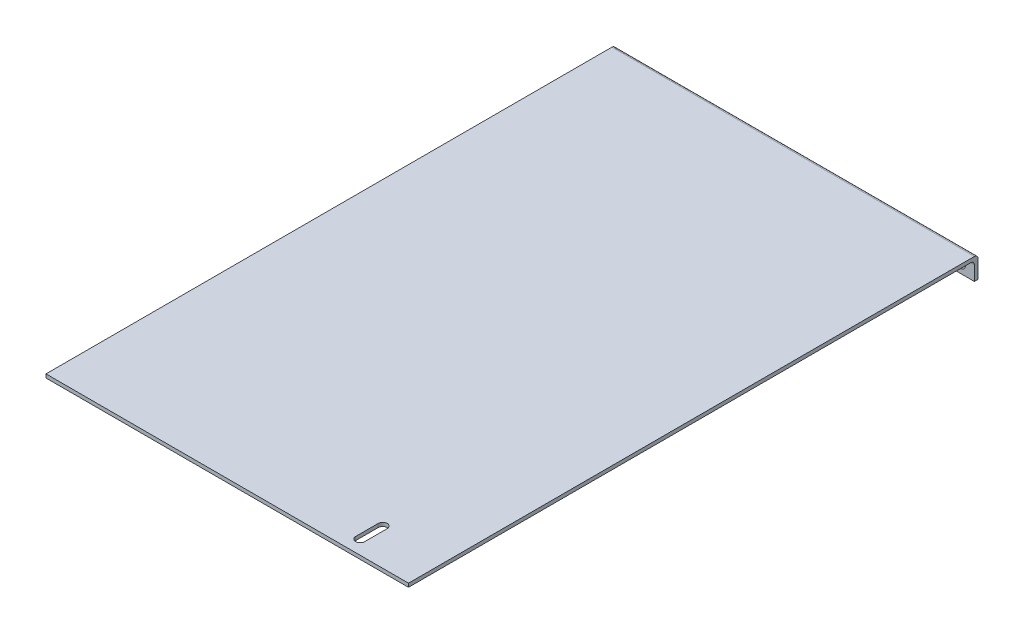
ISO-10303-21;
HEADER;
FILE_DESCRIPTION(('STEP AP214'),'2;1');
FILE_NAME('part.step','',(''),(''),'','','');
FILE_SCHEMA(('AUTOMOTIVE_DESIGN { 1 0 10303 214 1 1 1 1 }'));
ENDSEC;
DATA;
#1=APPLICATION_CONTEXT('core data for automotive mechanical design processes');
#2=APPLICATION_PROTOCOL_DEFINITION('international standard','automotive_design',2000,#1);
#3=PRODUCT_CONTEXT('',#1,'mechanical');
#4=PRODUCT('Part','Part','',(#3));
#5=PRODUCT_RELATED_PRODUCT_CATEGORY('part','',(#4));
#6=PRODUCT_DEFINITION_FORMATION('','',#4);
#7=PRODUCT_DEFINITION_CONTEXT('part definition',#1,'design');
#8=PRODUCT_DEFINITION('design','',#6,#7);
#9=PRODUCT_DEFINITION_SHAPE('','',#8);
#10=(LENGTH_UNIT() NAMED_UNIT(*) SI_UNIT(.MILLI.,.METRE.));
#11=(NAMED_UNIT(*) PLANE_ANGLE_UNIT() SI_UNIT($,.RADIAN.));
#12=(NAMED_UNIT(*) SI_UNIT($,.STERADIAN.) SOLID_ANGLE_UNIT());
#13=UNCERTAINTY_MEASURE_WITH_UNIT(LENGTH_MEASURE(1.E-05),#10,'distance_accuracy_value','');
#14=(GEOMETRIC_REPRESENTATION_CONTEXT(3) GLOBAL_UNCERTAINTY_ASSIGNED_CONTEXT((#13)) GLOBAL_UNIT_ASSIGNED_CONTEXT((#10,
#11,#12)) REPRESENTATION_CONTEXT('',''));
#15=CARTESIAN_POINT('',(0.,0.,0.));
#16=DIRECTION('',(0.,0.,1.));
#17=DIRECTION('',(1.,0.,0.));
#18=AXIS2_PLACEMENT_3D('',#15,#16,#17);
#19=CARTESIAN_POINT('',(200.5,-2.,-311.));
#20=DIRECTION('',(-1.,0.,0.));
#21=DIRECTION('',(0.,0.,1.));
#22=AXIS2_PLACEMENT_3D('',#19,#20,#21);
#23=CYLINDRICAL_SURFACE('',#22,2.);
#24=DIRECTION('',(1.,0.,0.));
#25=VECTOR('',#24,1.);
#26=CARTESIAN_POINT('',(200.5,0.,-311.));
#27=LINE('',#26,#25);
#28=CARTESIAN_POINT('',(0.,0.,-311.));
#29=VERTEX_POINT('',#28);
#30=CARTESIAN_POINT('',(200.5,0.,-311.));
#31=VERTEX_POINT('',#30);
#32=EDGE_CURVE('E223',#29,#31,#27,.T.);
#33=ORIENTED_EDGE('',*,*,#32,.F.);
#34=CARTESIAN_POINT('',(0.,-2.,-311.));
#35=DIRECTION('',(-1.,0.,0.));
#36=DIRECTION('',(0.,0.,1.));
#37=AXIS2_PLACEMENT_3D('',#34,#35,#36);
#38=CIRCLE('',#37,2.);
#39=CARTESIAN_POINT('',(0.,-2.,-313.));
#40=VERTEX_POINT('',#39);
#41=EDGE_CURVE('E40',#29,#40,#38,.T.);
#42=ORIENTED_EDGE('',*,*,#41,.T.);
#43=DIRECTION('',(1.,0.,0.));
#44=VECTOR('',#43,1.);
#45=CARTESIAN_POINT('',(200.5,-2.,-313.));
#46=LINE('',#45,#44);
#47=CARTESIAN_POINT('',(200.5,-2.,-313.));
#48=VERTEX_POINT('',#47);
#49=EDGE_CURVE('E226',#48,#40,#46,.F.);
#50=ORIENTED_EDGE('',*,*,#49,.F.);
#51=CARTESIAN_POINT('',(200.5,-2.,-311.));
#52=DIRECTION('',(-1.,0.,0.));
#53=DIRECTION('',(0.,0.,1.));
#54=AXIS2_PLACEMENT_3D('',#51,#52,#53);
#55=CIRCLE('',#54,2.);
#56=EDGE_CURVE('E11',#48,#31,#55,.F.);
#57=ORIENTED_EDGE('',*,*,#56,.T.);
#58=EDGE_LOOP('',(#33,#42,#50,#57));
#59=FACE_BOUND('',#58,.T.);
#60=ADVANCED_FACE('F33',(#59),#23,.F.);
#61=CARTESIAN_POINT('',(200.5,0.,-313.));
#62=DIRECTION('',(-1.,0.,0.));
#63=DIRECTION('',(0.,0.,1.));
#64=AXIS2_PLACEMENT_3D('',#61,#62,#63);
#65=CYLINDRICAL_SURFACE('',#64,2.);
#66=DIRECTION('',(-1.,0.,0.));
#67=VECTOR('',#66,1.);
#68=CARTESIAN_POINT('',(200.5,2.,-313.));
#69=LINE('',#68,#67);
#70=CARTESIAN_POINT('',(200.5,2.,-313.));
#71=VERTEX_POINT('',#70);
#72=CARTESIAN_POINT('',(0.,2.,-313.));
#73=VERTEX_POINT('',#72);
#74=EDGE_CURVE('E213',#71,#73,#69,.T.);
#75=ORIENTED_EDGE('',*,*,#74,.F.);
#76=CARTESIAN_POINT('',(200.5,0.,-313.));
#77=DIRECTION('',(-1.,0.,0.));
#78=DIRECTION('',(0.,0.,1.));
#79=AXIS2_PLACEMENT_3D('',#76,#77,#78);
#80=CIRCLE('',#79,2.);
#81=CARTESIAN_POINT('',(200.5,0.,-315.));
#82=VERTEX_POINT('',#81);
#83=EDGE_CURVE('E219',#82,#71,#80,.F.);
#84=ORIENTED_EDGE('',*,*,#83,.F.);
#85=DIRECTION('',(-1.,0.,0.));
#86=VECTOR('',#85,1.);
#87=CARTESIAN_POINT('',(200.5,0.,-315.));
#88=LINE('',#87,#86);
#89=CARTESIAN_POINT('',(0.,0.,-315.));
#90=VERTEX_POINT('',#89);
#91=EDGE_CURVE('E216',#90,#82,#88,.F.);
#92=ORIENTED_EDGE('',*,*,#91,.F.);
#93=CARTESIAN_POINT('',(0.,0.,-313.));
#94=DIRECTION('',(-1.,0.,0.));
#95=DIRECTION('',(0.,0.,1.));
#96=AXIS2_PLACEMENT_3D('',#93,#94,#95);
#97=CIRCLE('',#96,2.);
#98=EDGE_CURVE('E221',#73,#90,#97,.T.);
#99=ORIENTED_EDGE('',*,*,#98,.F.);
#100=EDGE_LOOP('',(#75,#84,#92,#99));
#101=FACE_BOUND('',#100,.T.);
#102=ADVANCED_FACE('F259',(#101),#65,.T.);
#103=CARTESIAN_POINT('',(200.5,0.,0.));
#104=DIRECTION('',(0.,1.,0.));
#105=DIRECTION('',(0.,0.,1.));
#106=AXIS2_PLACEMENT_3D('',#103,#104,#105);
#107=PLANE('',#106);
#108=CARTESIAN_POINT('',(166.,0.,-7.74999999999998));
#109=DIRECTION('',(0.,1.,0.));
#110=DIRECTION('',(0.,0.,1.));
#111=AXIS2_PLACEMENT_3D('',#108,#109,#110);
#112=CIRCLE('',#111,2.5);
#113=CARTESIAN_POINT('',(168.5,0.,-7.74999999999998));
#114=VERTEX_POINT('',#113);
#115=CARTESIAN_POINT('',(163.5,0.,-7.74999999999998));
#116=VERTEX_POINT('',#115);
#117=EDGE_CURVE('E140',#114,#116,#112,.F.);
#118=ORIENTED_EDGE('',*,*,#117,.F.);
#119=DIRECTION('',(0.,0.,1.));
#120=VECTOR('',#119,1.);
#121=CARTESIAN_POINT('',(168.5,0.,0.));
#122=LINE('',#121,#120);
#123=CARTESIAN_POINT('',(168.5,0.,-20.25));
#124=VERTEX_POINT('',#123);
#125=EDGE_CURVE('E122',#124,#114,#122,.T.);
#126=ORIENTED_EDGE('',*,*,#125,.F.);
#127=CARTESIAN_POINT('',(166.,0.,-20.25));
#128=DIRECTION('',(0.,1.,0.));
#129=DIRECTION('',(0.,0.,1.));
#130=AXIS2_PLACEMENT_3D('',#127,#128,#129);
#131=CIRCLE('',#130,2.5);
#132=CARTESIAN_POINT('',(163.5,0.,-20.25));
#133=VERTEX_POINT('',#132);
#134=EDGE_CURVE('E131',#133,#124,#131,.F.);
#135=ORIENTED_EDGE('',*,*,#134,.F.);
#136=DIRECTION('',(0.,0.,1.));
#137=VECTOR('',#136,1.);
#138=CARTESIAN_POINT('',(163.5,0.,0.));
#139=LINE('',#138,#137);
#140=EDGE_CURVE('E47',#133,#116,#139,.T.);
#141=ORIENTED_EDGE('',*,*,#140,.T.);
#142=EDGE_LOOP('',(#118,#126,#135,#141));
#143=FACE_BOUND('',#142,.T.);
#144=DIRECTION('',(0.,0.,-1.));
#145=VECTOR('',#144,1.);
#146=CARTESIAN_POINT('',(0.,0.,0.));
#147=LINE('',#146,#145);
#148=CARTESIAN_POINT('',(0.,0.,0.));
#149=VERTEX_POINT('',#148);
#150=EDGE_CURVE('E201',#149,#29,#147,.T.);
#151=ORIENTED_EDGE('',*,*,#150,.T.);
#152=ORIENTED_EDGE('',*,*,#32,.T.);
#153=DIRECTION('',(0.,0.,-1.));
#154=VECTOR('',#153,1.);
#155=CARTESIAN_POINT('',(200.5,0.,0.));
#156=LINE('',#155,#154);
#157=CARTESIAN_POINT('',(200.5,0.,0.));
#158=VERTEX_POINT('',#157);
#159=EDGE_CURVE('E189',#158,#31,#156,.T.);
#160=ORIENTED_EDGE('',*,*,#159,.F.);
#161=DIRECTION('',(-1.,0.,0.));
#162=VECTOR('',#161,1.);
#163=CARTESIAN_POINT('',(200.5,0.,0.));
#164=LINE('',#163,#162);
#165=EDGE_CURVE('E210',#158,#149,#164,.T.);
#166=ORIENTED_EDGE('',*,*,#165,.T.);
#167=EDGE_LOOP('',(#151,#152,#160,#166));
#168=FACE_BOUND('',#167,.T.);
#169=ADVANCED_FACE('F137',(#143,#168),#107,.F.);
#170=CARTESIAN_POINT('',(200.5,0.,0.));
#171=DIRECTION('',(0.,0.,-1.));
#172=DIRECTION('',(-1.,0.,0.));
#173=AXIS2_PLACEMENT_3D('',#170,#171,#172);
#174=PLANE('',#173);
#175=DIRECTION('',(0.,-1.,0.));
#176=VECTOR('',#175,1.);
#177=CARTESIAN_POINT('',(0.,0.,0.));
#178=LINE('',#177,#176);
#179=CARTESIAN_POINT('',(0.,2.,0.));
#180=VERTEX_POINT('',#179);
#181=EDGE_CURVE('E185',#180,#149,#178,.T.);
#182=ORIENTED_EDGE('',*,*,#181,.T.);
#183=ORIENTED_EDGE('',*,*,#165,.F.);
#184=DIRECTION('',(0.,-1.,0.));
#185=VECTOR('',#184,1.);
#186=CARTESIAN_POINT('',(200.5,0.,0.));
#187=LINE('',#186,#185);
#188=CARTESIAN_POINT('',(200.5,2.,0.));
#189=VERTEX_POINT('',#188);
#190=EDGE_CURVE('E186',#189,#158,#187,.T.);
#191=ORIENTED_EDGE('',*,*,#190,.F.);
#192=DIRECTION('',(-1.,0.,0.));
#193=VECTOR('',#192,1.);
#194=CARTESIAN_POINT('',(200.5,2.,0.));
#195=LINE('',#194,#193);
#196=EDGE_CURVE('E198',#189,#180,#195,.T.);
#197=ORIENTED_EDGE('',*,*,#196,.T.);
#198=EDGE_LOOP('',(#182,#183,#191,#197));
#199=FACE_BOUND('',#198,.T.);
#200=ADVANCED_FACE('F252',(#199),#174,.F.);
#201=CARTESIAN_POINT('',(200.5,0.,-315.));
#202=DIRECTION('',(0.,0.,1.));
#203=DIRECTION('',(1.,0.,0.));
#204=AXIS2_PLACEMENT_3D('',#201,#202,#203);
#205=PLANE('',#204);
#206=CARTESIAN_POINT('',(193.,-5.,-315.));
#207=DIRECTION('',(0.,0.,-1.));
#208=DIRECTION('',(-1.,0.,0.));
#209=AXIS2_PLACEMENT_3D('',#206,#207,#208);
#210=CIRCLE('',#209,2.5);
#211=CARTESIAN_POINT('',(190.5,-5.,-315.));
#212=VERTEX_POINT('',#211);
#213=EDGE_CURVE('E161',#212,#212,#210,.T.);
#214=ORIENTED_EDGE('',*,*,#213,.F.);
#215=EDGE_LOOP('',(#214));
#216=FACE_BOUND('',#215,.T.);
#217=CARTESIAN_POINT('',(7.5,-5.,-315.));
#218=DIRECTION('',(0.,0.,-1.));
#219=DIRECTION('',(-1.,0.,0.));
#220=AXIS2_PLACEMENT_3D('',#217,#218,#219);
#221=CIRCLE('',#220,2.5);
#222=CARTESIAN_POINT('',(5.,-5.,-315.));
#223=VERTEX_POINT('',#222);
#224=EDGE_CURVE('E134',#223,#223,#221,.T.);
#225=ORIENTED_EDGE('',*,*,#224,.F.);
#226=EDGE_LOOP('',(#225));
#227=FACE_BOUND('',#226,.T.);
#228=DIRECTION('',(0.,1.,0.));
#229=VECTOR('',#228,1.);
#230=CARTESIAN_POINT('',(0.,0.,-315.));
#231=LINE('',#230,#229);
#232=CARTESIAN_POINT('',(0.,-10.,-315.));
#233=VERTEX_POINT('',#232);
#234=EDGE_CURVE('E204',#233,#90,#231,.T.);
#235=ORIENTED_EDGE('',*,*,#234,.T.);
#236=ORIENTED_EDGE('',*,*,#91,.T.);
#237=DIRECTION('',(0.,1.,0.));
#238=VECTOR('',#237,1.);
#239=CARTESIAN_POINT('',(200.5,0.,-315.));
#240=LINE('',#239,#238);
#241=CARTESIAN_POINT('',(200.5,-10.,-315.));
#242=VERTEX_POINT('',#241);
#243=EDGE_CURVE('E193',#242,#82,#240,.T.);
#244=ORIENTED_EDGE('',*,*,#243,.F.);
#245=DIRECTION('',(1.,0.,0.));
#246=VECTOR('',#245,1.);
#247=CARTESIAN_POINT('',(200.5,-10.,-315.));
#248=LINE('',#247,#246);
#249=EDGE_CURVE('E176',#233,#242,#248,.T.);
#250=ORIENTED_EDGE('',*,*,#249,.F.);
#251=EDGE_LOOP('',(#235,#236,#244,#250));
#252=FACE_BOUND('',#251,.T.);
#253=ADVANCED_FACE('F244',(#216,#227,#252),#205,.F.);
#254=CARTESIAN_POINT('',(200.5,2.,0.));
#255=DIRECTION('',(0.,-1.,0.));
#256=DIRECTION('',(0.,0.,-1.));
#257=AXIS2_PLACEMENT_3D('',#254,#255,#256);
#258=PLANE('',#257);
#259=CARTESIAN_POINT('',(166.,2.,-20.25));
#260=DIRECTION('',(0.,1.,0.));
#261=DIRECTION('',(0.,0.,1.));
#262=AXIS2_PLACEMENT_3D('',#259,#260,#261);
#263=CIRCLE('',#262,2.5);
#264=CARTESIAN_POINT('',(168.5,2.,-20.25));
#265=VERTEX_POINT('',#264);
#266=CARTESIAN_POINT('',(163.5,2.,-20.25));
#267=VERTEX_POINT('',#266);
#268=EDGE_CURVE('E142',#265,#267,#263,.T.);
#269=ORIENTED_EDGE('',*,*,#268,.F.);
#270=DIRECTION('',(0.,0.,-1.));
#271=VECTOR('',#270,1.);
#272=CARTESIAN_POINT('',(168.5,2.,0.));
#273=LINE('',#272,#271);
#274=CARTESIAN_POINT('',(168.5,2.,-7.74999999999998));
#275=VERTEX_POINT('',#274);
#276=EDGE_CURVE('E55',#275,#265,#273,.T.);
#277=ORIENTED_EDGE('',*,*,#276,.F.);
#278=CARTESIAN_POINT('',(166.,2.,-7.74999999999998));
#279=DIRECTION('',(0.,1.,0.));
#280=DIRECTION('',(0.,0.,1.));
#281=AXIS2_PLACEMENT_3D('',#278,#279,#280);
#282=CIRCLE('',#281,2.5);
#283=CARTESIAN_POINT('',(163.5,2.,-7.74999999999998));
#284=VERTEX_POINT('',#283);
#285=EDGE_CURVE('E128',#284,#275,#282,.T.);
#286=ORIENTED_EDGE('',*,*,#285,.F.);
#287=DIRECTION('',(0.,0.,-1.));
#288=VECTOR('',#287,1.);
#289=CARTESIAN_POINT('',(163.5,2.,0.));
#290=LINE('',#289,#288);
#291=EDGE_CURVE('E148',#284,#267,#290,.T.);
#292=ORIENTED_EDGE('',*,*,#291,.T.);
#293=EDGE_LOOP('',(#269,#277,#286,#292));
#294=FACE_BOUND('',#293,.T.);
#295=DIRECTION('',(0.,0.,1.));
#296=VECTOR('',#295,1.);
#297=CARTESIAN_POINT('',(200.5,2.,0.));
#298=LINE('',#297,#296);
#299=EDGE_CURVE('E196',#71,#189,#298,.T.);
#300=ORIENTED_EDGE('',*,*,#299,.F.);
#301=ORIENTED_EDGE('',*,*,#74,.T.);
#302=DIRECTION('',(0.,0.,1.));
#303=VECTOR('',#302,1.);
#304=CARTESIAN_POINT('',(0.,2.,0.));
#305=LINE('',#304,#303);
#306=EDGE_CURVE('E190',#73,#180,#305,.T.);
#307=ORIENTED_EDGE('',*,*,#306,.T.);
#308=ORIENTED_EDGE('',*,*,#196,.F.);
#309=EDGE_LOOP('',(#300,#301,#307,#308));
#310=FACE_BOUND('',#309,.T.);
#311=ADVANCED_FACE('F257',(#294,#310),#258,.F.);
#312=CARTESIAN_POINT('',(200.5,0.,0.));
#313=DIRECTION('',(-1.,0.,0.));
#314=DIRECTION('',(0.,0.,1.));
#315=AXIS2_PLACEMENT_3D('',#312,#313,#314);
#316=PLANE('',#315);
#317=ORIENTED_EDGE('',*,*,#243,.T.);
#318=ORIENTED_EDGE('',*,*,#83,.T.);
#319=ORIENTED_EDGE('',*,*,#299,.T.);
#320=ORIENTED_EDGE('',*,*,#190,.T.);
#321=ORIENTED_EDGE('',*,*,#159,.T.);
#322=ORIENTED_EDGE('',*,*,#56,.F.);
#323=DIRECTION('',(0.,1.,0.));
#324=VECTOR('',#323,1.);
#325=CARTESIAN_POINT('',(200.5,-10.,-313.));
#326=LINE('',#325,#324);
#327=CARTESIAN_POINT('',(200.5,-10.,-313.));
#328=VERTEX_POINT('',#327);
#329=EDGE_CURVE('E182',#328,#48,#326,.T.);
#330=ORIENTED_EDGE('',*,*,#329,.F.);
#331=DIRECTION('',(0.,0.,1.));
#332=VECTOR('',#331,1.);
#333=CARTESIAN_POINT('',(200.5,-10.,-313.));
#334=LINE('',#333,#332);
#335=EDGE_CURVE('E160',#242,#328,#334,.T.);
#336=ORIENTED_EDGE('',*,*,#335,.F.);
#337=EDGE_LOOP('',(#317,#318,#319,#320,#321,#322,#330,#336));
#338=FACE_BOUND('',#337,.T.);
#339=ADVANCED_FACE('F247',(#338),#316,.F.);
#340=CARTESIAN_POINT('',(0.,0.,0.));
#341=DIRECTION('',(-1.,0.,0.));
#342=DIRECTION('',(0.,0.,1.));
#343=AXIS2_PLACEMENT_3D('',#340,#341,#342);
#344=PLANE('',#343);
#345=ORIENTED_EDGE('',*,*,#306,.F.);
#346=ORIENTED_EDGE('',*,*,#98,.T.);
#347=ORIENTED_EDGE('',*,*,#234,.F.);
#348=DIRECTION('',(0.,0.,-1.));
#349=VECTOR('',#348,1.);
#350=CARTESIAN_POINT('',(0.,-10.,-315.));
#351=LINE('',#350,#349);
#352=CARTESIAN_POINT('',(0.,-10.,-313.));
#353=VERTEX_POINT('',#352);
#354=EDGE_CURVE('E173',#353,#233,#351,.T.);
#355=ORIENTED_EDGE('',*,*,#354,.F.);
#356=DIRECTION('',(0.,1.,0.));
#357=VECTOR('',#356,1.);
#358=CARTESIAN_POINT('',(0.,-10.,-313.));
#359=LINE('',#358,#357);
#360=EDGE_CURVE('E179',#353,#40,#359,.T.);
#361=ORIENTED_EDGE('',*,*,#360,.T.);
#362=ORIENTED_EDGE('',*,*,#41,.F.);
#363=ORIENTED_EDGE('',*,*,#150,.F.);
#364=ORIENTED_EDGE('',*,*,#181,.F.);
#365=EDGE_LOOP('',(#345,#346,#347,#355,#361,#362,#363,#364));
#366=FACE_BOUND('',#365,.T.);
#367=ADVANCED_FACE('F238',(#366),#344,.T.);
#368=CARTESIAN_POINT('',(200.5,-10.,-313.));
#369=DIRECTION('',(0.,0.,-1.));
#370=DIRECTION('',(-1.,0.,0.));
#371=AXIS2_PLACEMENT_3D('',#368,#369,#370);
#372=PLANE('',#371);
#373=CARTESIAN_POINT('',(193.,-5.,-313.));
#374=DIRECTION('',(0.,0.,-1.));
#375=DIRECTION('',(-1.,0.,0.));
#376=AXIS2_PLACEMENT_3D('',#373,#374,#375);
#377=CIRCLE('',#376,2.5);
#378=CARTESIAN_POINT('',(190.5,-5.,-313.));
#379=VERTEX_POINT('',#378);
#380=EDGE_CURVE('E157',#379,#379,#377,.T.);
#381=ORIENTED_EDGE('',*,*,#380,.T.);
#382=EDGE_LOOP('',(#381));
#383=FACE_BOUND('',#382,.T.);
#384=CARTESIAN_POINT('',(7.5,-5.,-313.));
#385=DIRECTION('',(0.,0.,-1.));
#386=DIRECTION('',(-1.,0.,0.));
#387=AXIS2_PLACEMENT_3D('',#384,#385,#386);
#388=CIRCLE('',#387,2.5);
#389=CARTESIAN_POINT('',(5.,-5.,-313.));
#390=VERTEX_POINT('',#389);
#391=EDGE_CURVE('E164',#390,#390,#388,.T.);
#392=ORIENTED_EDGE('',*,*,#391,.T.);
#393=EDGE_LOOP('',(#392));
#394=FACE_BOUND('',#393,.T.);
#395=ORIENTED_EDGE('',*,*,#329,.T.);
#396=ORIENTED_EDGE('',*,*,#49,.T.);
#397=ORIENTED_EDGE('',*,*,#360,.F.);
#398=DIRECTION('',(-1.,0.,0.));
#399=VECTOR('',#398,1.);
#400=CARTESIAN_POINT('',(200.5,-10.,-313.));
#401=LINE('',#400,#399);
#402=EDGE_CURVE('E171',#328,#353,#401,.T.);
#403=ORIENTED_EDGE('',*,*,#402,.F.);
#404=EDGE_LOOP('',(#395,#396,#397,#403));
#405=FACE_BOUND('',#404,.T.);
#406=ADVANCED_FACE('F234',(#383,#394,#405),#372,.F.);
#407=CARTESIAN_POINT('',(0.,-10.,0.));
#408=DIRECTION('',(0.,1.,0.));
#409=DIRECTION('',(0.,0.,1.));
#410=AXIS2_PLACEMENT_3D('',#407,#408,#409);
#411=PLANE('',#410);
#412=ORIENTED_EDGE('',*,*,#335,.T.);
#413=ORIENTED_EDGE('',*,*,#402,.T.);
#414=ORIENTED_EDGE('',*,*,#354,.T.);
#415=ORIENTED_EDGE('',*,*,#249,.T.);
#416=EDGE_LOOP('',(#412,#413,#414,#415));
#417=FACE_BOUND('',#416,.T.);
#418=ADVANCED_FACE('F241',(#417),#411,.F.);
#419=CARTESIAN_POINT('',(7.5,-5.,-313.));
#420=DIRECTION('',(0.,0.,-1.));
#421=DIRECTION('',(-1.,0.,0.));
#422=AXIS2_PLACEMENT_3D('',#419,#420,#421);
#423=CYLINDRICAL_SURFACE('',#422,2.5);
#424=ORIENTED_EDGE('',*,*,#391,.F.);
#425=EDGE_LOOP('',(#424));
#426=FACE_BOUND('',#425,.T.);
#427=ORIENTED_EDGE('',*,*,#224,.T.);
#428=EDGE_LOOP('',(#427));
#429=FACE_BOUND('',#428,.T.);
#430=ADVANCED_FACE('F284',(#426,#429),#423,.F.);
#431=CARTESIAN_POINT('',(193.,-5.,-313.));
#432=DIRECTION('',(0.,0.,-1.));
#433=DIRECTION('',(-1.,0.,0.));
#434=AXIS2_PLACEMENT_3D('',#431,#432,#433);
#435=CYLINDRICAL_SURFACE('',#434,2.5);
#436=ORIENTED_EDGE('',*,*,#380,.F.);
#437=EDGE_LOOP('',(#436));
#438=FACE_BOUND('',#437,.T.);
#439=ORIENTED_EDGE('',*,*,#213,.T.);
#440=EDGE_LOOP('',(#439));
#441=FACE_BOUND('',#440,.T.);
#442=ADVANCED_FACE('F287',(#438,#441),#435,.F.);
#443=CARTESIAN_POINT('',(168.5,-10.001,0.));
#444=DIRECTION('',(1.,0.,0.));
#445=DIRECTION('',(0.,0.,-1.));
#446=AXIS2_PLACEMENT_3D('',#443,#444,#445);
#447=PLANE('',#446);
#448=ORIENTED_EDGE('',*,*,#125,.T.);
#449=DIRECTION('',(0.,1.,0.));
#450=VECTOR('',#449,1.);
#451=CARTESIAN_POINT('',(168.5,-10.001,-7.74999999999998));
#452=LINE('',#451,#450);
#453=EDGE_CURVE('E135',#114,#275,#452,.T.);
#454=ORIENTED_EDGE('',*,*,#453,.T.);
#455=ORIENTED_EDGE('',*,*,#276,.T.);
#456=DIRECTION('',(0.,1.,0.));
#457=VECTOR('',#456,1.);
#458=CARTESIAN_POINT('',(168.5,-10.001,-20.25));
#459=LINE('',#458,#457);
#460=EDGE_CURVE('E118',#124,#265,#459,.T.);
#461=ORIENTED_EDGE('',*,*,#460,.F.);
#462=EDGE_LOOP('',(#448,#454,#455,#461));
#463=FACE_BOUND('',#462,.T.);
#464=ADVANCED_FACE('F120',(#463),#447,.F.);
#465=CARTESIAN_POINT('',(166.,-10.001,-7.74999999999998));
#466=DIRECTION('',(0.,1.,0.));
#467=DIRECTION('',(0.,0.,1.));
#468=AXIS2_PLACEMENT_3D('',#465,#466,#467);
#469=CYLINDRICAL_SURFACE('',#468,2.5);
#470=ORIENTED_EDGE('',*,*,#117,.T.);
#471=DIRECTION('',(0.,1.,0.));
#472=VECTOR('',#471,1.);
#473=CARTESIAN_POINT('',(163.5,-10.001,-7.74999999999998));
#474=LINE('',#473,#472);
#475=EDGE_CURVE('E154',#116,#284,#474,.T.);
#476=ORIENTED_EDGE('',*,*,#475,.T.);
#477=ORIENTED_EDGE('',*,*,#285,.T.);
#478=ORIENTED_EDGE('',*,*,#453,.F.);
#479=EDGE_LOOP('',(#470,#476,#477,#478));
#480=FACE_BOUND('',#479,.T.);
#481=ADVANCED_FACE('F294',(#480),#469,.F.);
#482=CARTESIAN_POINT('',(163.5,-10.001,0.));
#483=DIRECTION('',(1.,0.,0.));
#484=DIRECTION('',(0.,0.,-1.));
#485=AXIS2_PLACEMENT_3D('',#482,#483,#484);
#486=PLANE('',#485);
#487=DIRECTION('',(0.,1.,0.));
#488=VECTOR('',#487,1.);
#489=CARTESIAN_POINT('',(163.5,-10.001,-20.25));
#490=LINE('',#489,#488);
#491=EDGE_CURVE('E127',#133,#267,#490,.T.);
#492=ORIENTED_EDGE('',*,*,#491,.T.);
#493=ORIENTED_EDGE('',*,*,#291,.F.);
#494=ORIENTED_EDGE('',*,*,#475,.F.);
#495=ORIENTED_EDGE('',*,*,#140,.F.);
#496=EDGE_LOOP('',(#492,#493,#494,#495));
#497=FACE_BOUND('',#496,.T.);
#498=ADVANCED_FACE('F297',(#497),#486,.T.);
#499=CARTESIAN_POINT('',(166.,-10.001,-20.25));
#500=DIRECTION('',(0.,1.,0.));
#501=DIRECTION('',(0.,0.,1.));
#502=AXIS2_PLACEMENT_3D('',#499,#500,#501);
#503=CYLINDRICAL_SURFACE('',#502,2.5);
#504=ORIENTED_EDGE('',*,*,#134,.T.);
#505=ORIENTED_EDGE('',*,*,#460,.T.);
#506=ORIENTED_EDGE('',*,*,#268,.T.);
#507=ORIENTED_EDGE('',*,*,#491,.F.);
#508=EDGE_LOOP('',(#504,#505,#506,#507));
#509=FACE_BOUND('',#508,.T.);
#510=ADVANCED_FACE('F132',(#509),#503,.F.);
#511=CLOSED_SHELL('',(#60,#102,#169,#200,#253,#311,#339,#367,#406,#418,#430,#442,#464,#481,#498,#510));
#512=MANIFOLD_SOLID_BREP('B2',#511);
#513=ADVANCED_BREP_SHAPE_REPRESENTATION('',(#18,#512),#14);
#514=SHAPE_DEFINITION_REPRESENTATION(#9,#513);
ENDSEC;
END-ISO-10303-21;
